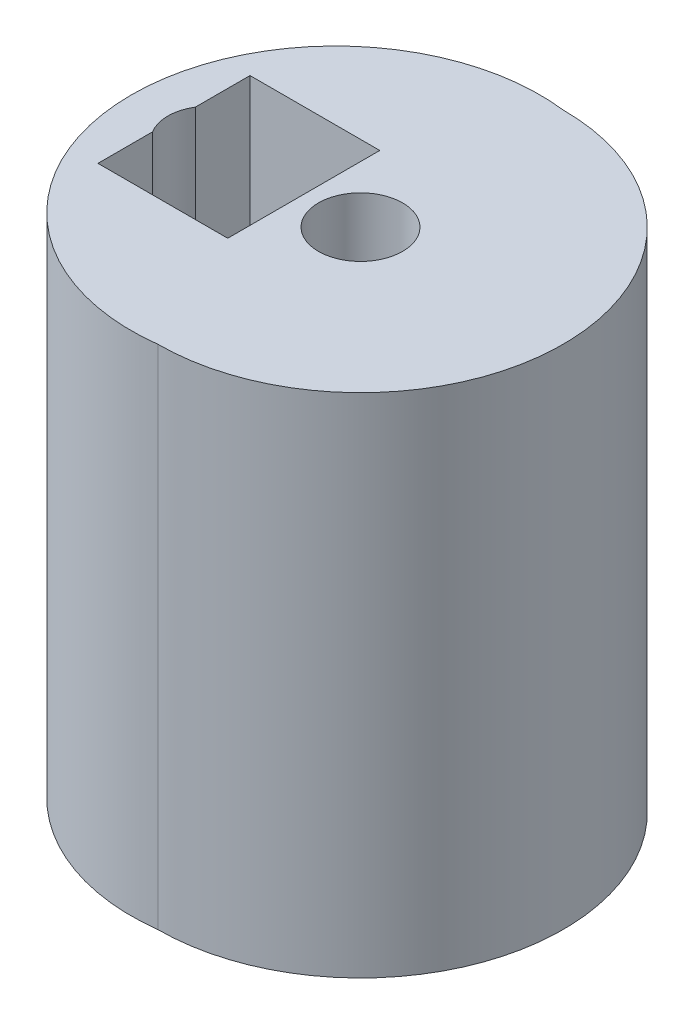
ISO-10303-21;
HEADER;
FILE_DESCRIPTION(('STEP AP214'),'2;1');
FILE_NAME('part.step','',(''),(''),'','','');
FILE_SCHEMA(('AUTOMOTIVE_DESIGN { 1 0 10303 214 1 1 1 1 }'));
ENDSEC;
DATA;
#1=APPLICATION_CONTEXT('core data for automotive mechanical design processes');
#2=APPLICATION_PROTOCOL_DEFINITION('international standard','automotive_design',2000,#1);
#3=PRODUCT_CONTEXT('',#1,'mechanical');
#4=PRODUCT('Part','Part','',(#3));
#5=PRODUCT_RELATED_PRODUCT_CATEGORY('part','',(#4));
#6=PRODUCT_DEFINITION_FORMATION('','',#4);
#7=PRODUCT_DEFINITION_CONTEXT('part definition',#1,'design');
#8=PRODUCT_DEFINITION('design','',#6,#7);
#9=PRODUCT_DEFINITION_SHAPE('','',#8);
#10=(LENGTH_UNIT() NAMED_UNIT(*) SI_UNIT(.MILLI.,.METRE.));
#11=(NAMED_UNIT(*) PLANE_ANGLE_UNIT() SI_UNIT($,.RADIAN.));
#12=(NAMED_UNIT(*) SI_UNIT($,.STERADIAN.) SOLID_ANGLE_UNIT());
#13=UNCERTAINTY_MEASURE_WITH_UNIT(LENGTH_MEASURE(1.E-05),#10,'distance_accuracy_value','');
#14=(GEOMETRIC_REPRESENTATION_CONTEXT(3) GLOBAL_UNCERTAINTY_ASSIGNED_CONTEXT((#13)) GLOBAL_UNIT_ASSIGNED_CONTEXT((#10,
#11,#12)) REPRESENTATION_CONTEXT('',''));
#15=CARTESIAN_POINT('',(0.,0.,0.));
#16=DIRECTION('',(0.,0.,1.));
#17=DIRECTION('',(1.,0.,0.));
#18=AXIS2_PLACEMENT_3D('',#15,#16,#17);
#19=CARTESIAN_POINT('',(-2.45407823836158,50.,0.));
#20=DIRECTION('',(0.,-1.,0.));
#21=DIRECTION('',(0.,0.,-1.));
#22=AXIS2_PLACEMENT_3D('',#19,#20,#21);
#23=CYLINDRICAL_SURFACE('',#22,20.15);
#24=CARTESIAN_POINT('',(-2.45407823836158,0.,0.));
#25=DIRECTION('',(0.,1.,0.));
#26=DIRECTION('',(0.,0.,1.));
#27=AXIS2_PLACEMENT_3D('',#24,#25,#26);
#28=CIRCLE('',#27,20.15);
#29=CARTESIAN_POINT('',(0.,0.,-20.));
#30=VERTEX_POINT('',#29);
#31=CARTESIAN_POINT('',(0.,0.,20.));
#32=VERTEX_POINT('',#31);
#33=EDGE_CURVE('E180',#30,#32,#28,.T.);
#34=ORIENTED_EDGE('',*,*,#33,.T.);
#35=DIRECTION('',(0.,-1.,0.));
#36=VECTOR('',#35,1.);
#37=CARTESIAN_POINT('',(0.,50.,20.));
#38=LINE('',#37,#36);
#39=CARTESIAN_POINT('',(0.,50.,20.));
#40=VERTEX_POINT('',#39);
#41=EDGE_CURVE('E193',#40,#32,#38,.T.);
#42=ORIENTED_EDGE('',*,*,#41,.F.);
#43=CARTESIAN_POINT('',(-2.45407823836158,50.,0.));
#44=DIRECTION('',(0.,1.,0.));
#45=DIRECTION('',(0.,0.,1.));
#46=AXIS2_PLACEMENT_3D('',#43,#44,#45);
#47=CIRCLE('',#46,20.15);
#48=CARTESIAN_POINT('',(0.,50.,-20.));
#49=VERTEX_POINT('',#48);
#50=EDGE_CURVE('E181',#49,#40,#47,.T.);
#51=ORIENTED_EDGE('',*,*,#50,.F.);
#52=DIRECTION('',(0.,-1.,0.));
#53=VECTOR('',#52,1.);
#54=CARTESIAN_POINT('',(0.,50.,-20.));
#55=LINE('',#54,#53);
#56=EDGE_CURVE('E187',#49,#30,#55,.T.);
#57=ORIENTED_EDGE('',*,*,#56,.T.);
#58=EDGE_LOOP('',(#34,#42,#51,#57));
#59=FACE_BOUND('',#58,.T.);
#60=ADVANCED_FACE('F36',(#59),#23,.T.);
#61=CARTESIAN_POINT('',(0.,50.,0.));
#62=DIRECTION('',(0.,-1.,0.));
#63=DIRECTION('',(0.,0.,-1.));
#64=AXIS2_PLACEMENT_3D('',#61,#62,#63);
#65=CYLINDRICAL_SURFACE('',#64,20.);
#66=CARTESIAN_POINT('',(0.,0.,0.));
#67=DIRECTION('',(0.,1.,0.));
#68=DIRECTION('',(0.,0.,-1.));
#69=AXIS2_PLACEMENT_3D('',#66,#67,#68);
#70=CIRCLE('',#69,20.);
#71=EDGE_CURVE('E185',#32,#30,#70,.T.);
#72=ORIENTED_EDGE('',*,*,#71,.T.);
#73=ORIENTED_EDGE('',*,*,#56,.F.);
#74=CARTESIAN_POINT('',(0.,50.,0.));
#75=DIRECTION('',(0.,1.,0.));
#76=DIRECTION('',(0.,0.,-1.));
#77=AXIS2_PLACEMENT_3D('',#74,#75,#76);
#78=CIRCLE('',#77,20.);
#79=EDGE_CURVE('E184',#40,#49,#78,.T.);
#80=ORIENTED_EDGE('',*,*,#79,.F.);
#81=ORIENTED_EDGE('',*,*,#41,.T.);
#82=EDGE_LOOP('',(#72,#73,#80,#81));
#83=FACE_BOUND('',#82,.T.);
#84=ADVANCED_FACE('F230',(#83),#65,.T.);
#85=CARTESIAN_POINT('',(-1.22703911918079,50.,0.));
#86=DIRECTION('',(0.,1.,0.));
#87=DIRECTION('',(0.,0.,1.));
#88=AXIS2_PLACEMENT_3D('',#85,#86,#87);
#89=PLANE('',#88);
#90=CARTESIAN_POINT('',(-15.,50.,0.));
#91=DIRECTION('',(0.,1.,0.));
#92=DIRECTION('',(0.,0.,1.));
#93=AXIS2_PLACEMENT_3D('',#90,#91,#92);
#94=CIRCLE('',#93,4.00000000000001);
#95=CARTESIAN_POINT('',(-18.4,50.,-2.10713075057054));
#96=VERTEX_POINT('',#95);
#97=CARTESIAN_POINT('',(-18.4,50.,2.10713075057054));
#98=VERTEX_POINT('',#97);
#99=EDGE_CURVE('E50',#96,#98,#94,.T.);
#100=ORIENTED_EDGE('',*,*,#99,.F.);
#101=DIRECTION('',(0.,0.,1.));
#102=VECTOR('',#101,1.);
#103=CARTESIAN_POINT('',(-18.4,50.,-7.5));
#104=LINE('',#103,#102);
#105=CARTESIAN_POINT('',(-18.4,50.,-7.5));
#106=VERTEX_POINT('',#105);
#107=EDGE_CURVE('E136',#106,#96,#104,.T.);
#108=ORIENTED_EDGE('',*,*,#107,.F.);
#109=DIRECTION('',(-1.,0.,0.));
#110=VECTOR('',#109,1.);
#111=CARTESIAN_POINT('',(-5.6,50.,-7.5));
#112=LINE('',#111,#110);
#113=CARTESIAN_POINT('',(-5.6,50.,-7.5));
#114=VERTEX_POINT('',#113);
#115=EDGE_CURVE('E139',#114,#106,#112,.T.);
#116=ORIENTED_EDGE('',*,*,#115,.F.);
#117=DIRECTION('',(0.,0.,-1.));
#118=VECTOR('',#117,1.);
#119=CARTESIAN_POINT('',(-5.6,50.,7.5));
#120=LINE('',#119,#118);
#121=CARTESIAN_POINT('',(-5.6,50.,7.5));
#122=VERTEX_POINT('',#121);
#123=EDGE_CURVE('E152',#122,#114,#120,.T.);
#124=ORIENTED_EDGE('',*,*,#123,.F.);
#125=DIRECTION('',(1.,0.,0.));
#126=VECTOR('',#125,1.);
#127=CARTESIAN_POINT('',(-5.6,50.,7.5));
#128=LINE('',#127,#126);
#129=CARTESIAN_POINT('',(-18.4,50.,7.5));
#130=VERTEX_POINT('',#129);
#131=EDGE_CURVE('E149',#130,#122,#128,.T.);
#132=ORIENTED_EDGE('',*,*,#131,.F.);
#133=DIRECTION('',(0.,0.,1.));
#134=VECTOR('',#133,1.);
#135=CARTESIAN_POINT('',(-18.4,50.,2.10713075057054));
#136=LINE('',#135,#134);
#137=EDGE_CURVE('E147',#98,#130,#136,.T.);
#138=ORIENTED_EDGE('',*,*,#137,.F.);
#139=EDGE_LOOP('',(#100,#108,#116,#124,#132,#138));
#140=FACE_BOUND('',#139,.T.);
#141=CARTESIAN_POINT('',(0.,50.,0.));
#142=DIRECTION('',(0.,1.,0.));
#143=DIRECTION('',(0.,0.,1.));
#144=AXIS2_PLACEMENT_3D('',#141,#142,#143);
#145=CIRCLE('',#144,4.15);
#146=CARTESIAN_POINT('',(0.,50.,4.15));
#147=VERTEX_POINT('',#146);
#148=EDGE_CURVE('E170',#147,#147,#145,.T.);
#149=ORIENTED_EDGE('',*,*,#148,.F.);
#150=EDGE_LOOP('',(#149));
#151=FACE_BOUND('',#150,.T.);
#152=ORIENTED_EDGE('',*,*,#50,.T.);
#153=ORIENTED_EDGE('',*,*,#79,.T.);
#154=EDGE_LOOP('',(#152,#153));
#155=FACE_BOUND('',#154,.T.);
#156=ADVANCED_FACE('F216',(#140,#151,#155),#89,.T.);
#157=CARTESIAN_POINT('',(-1.22703911918079,0.,0.));
#158=DIRECTION('',(0.,1.,0.));
#159=DIRECTION('',(0.,0.,1.));
#160=AXIS2_PLACEMENT_3D('',#157,#158,#159);
#161=PLANE('',#160);
#162=CARTESIAN_POINT('',(0.,0.,0.));
#163=DIRECTION('',(0.,-1.,0.));
#164=DIRECTION('',(0.,0.,-1.));
#165=AXIS2_PLACEMENT_3D('',#162,#163,#164);
#166=CIRCLE('',#165,13.5);
#167=CARTESIAN_POINT('',(-11.2249721603218,0.,-7.5));
#168=VERTEX_POINT('',#167);
#169=CARTESIAN_POINT('',(-11.2249721603218,0.,7.5));
#170=VERTEX_POINT('',#169);
#171=EDGE_CURVE('E174',#168,#170,#166,.T.);
#172=ORIENTED_EDGE('',*,*,#171,.F.);
#173=DIRECTION('',(-1.,0.,0.));
#174=VECTOR('',#173,1.);
#175=CARTESIAN_POINT('',(-5.6,0.,-7.5));
#176=LINE('',#175,#174);
#177=CARTESIAN_POINT('',(-18.4,0.,-7.5));
#178=VERTEX_POINT('',#177);
#179=EDGE_CURVE('E143',#168,#178,#176,.T.);
#180=ORIENTED_EDGE('',*,*,#179,.T.);
#181=DIRECTION('',(0.,0.,1.));
#182=VECTOR('',#181,1.);
#183=CARTESIAN_POINT('',(-18.4,0.,-7.5));
#184=LINE('',#183,#182);
#185=CARTESIAN_POINT('',(-18.4,0.,-2.10713075057054));
#186=VERTEX_POINT('',#185);
#187=EDGE_CURVE('E121',#178,#186,#184,.T.);
#188=ORIENTED_EDGE('',*,*,#187,.T.);
#189=CARTESIAN_POINT('',(-15.,0.,0.));
#190=DIRECTION('',(0.,1.,0.));
#191=DIRECTION('',(0.,0.,1.));
#192=AXIS2_PLACEMENT_3D('',#189,#190,#191);
#193=CIRCLE('',#192,4.00000000000001);
#194=CARTESIAN_POINT('',(-18.4,0.,2.10713075057054));
#195=VERTEX_POINT('',#194);
#196=EDGE_CURVE('E115',#186,#195,#193,.T.);
#197=ORIENTED_EDGE('',*,*,#196,.T.);
#198=DIRECTION('',(0.,0.,1.));
#199=VECTOR('',#198,1.);
#200=CARTESIAN_POINT('',(-18.4,0.,2.10713075057054));
#201=LINE('',#200,#199);
#202=CARTESIAN_POINT('',(-18.4,0.,7.5));
#203=VERTEX_POINT('',#202);
#204=EDGE_CURVE('E124',#195,#203,#201,.T.);
#205=ORIENTED_EDGE('',*,*,#204,.T.);
#206=DIRECTION('',(1.,0.,0.));
#207=VECTOR('',#206,1.);
#208=CARTESIAN_POINT('',(-5.6,0.,7.5));
#209=LINE('',#208,#207);
#210=EDGE_CURVE('E129',#203,#170,#209,.T.);
#211=ORIENTED_EDGE('',*,*,#210,.T.);
#212=EDGE_LOOP('',(#172,#180,#188,#197,#205,#211));
#213=FACE_BOUND('',#212,.T.);
#214=ORIENTED_EDGE('',*,*,#33,.F.);
#215=ORIENTED_EDGE('',*,*,#71,.F.);
#216=EDGE_LOOP('',(#214,#215));
#217=FACE_BOUND('',#216,.T.);
#218=ADVANCED_FACE('F132',(#213,#217),#161,.F.);
#219=CARTESIAN_POINT('',(-1.22703911918079,32.,0.));
#220=DIRECTION('',(0.,1.,0.));
#221=DIRECTION('',(0.,0.,1.));
#222=AXIS2_PLACEMENT_3D('',#219,#220,#221);
#223=PLANE('',#222);
#224=CARTESIAN_POINT('',(0.,32.,0.));
#225=DIRECTION('',(0.,1.,0.));
#226=DIRECTION('',(0.,0.,1.));
#227=AXIS2_PLACEMENT_3D('',#224,#225,#226);
#228=CIRCLE('',#227,4.15);
#229=CARTESIAN_POINT('',(0.,32.,4.15));
#230=VERTEX_POINT('',#229);
#231=EDGE_CURVE('E173',#230,#230,#228,.T.);
#232=ORIENTED_EDGE('',*,*,#231,.T.);
#233=EDGE_LOOP('',(#232));
#234=FACE_BOUND('',#233,.T.);
#235=DIRECTION('',(0.,0.,-1.));
#236=VECTOR('',#235,1.);
#237=CARTESIAN_POINT('',(-5.6,32.,0.));
#238=LINE('',#237,#236);
#239=CARTESIAN_POINT('',(-5.6,32.,7.5));
#240=VERTEX_POINT('',#239);
#241=CARTESIAN_POINT('',(-5.6,32.,-7.5));
#242=VERTEX_POINT('',#241);
#243=EDGE_CURVE('E12',#240,#242,#238,.T.);
#244=ORIENTED_EDGE('',*,*,#243,.T.);
#245=DIRECTION('',(-1.,0.,0.));
#246=VECTOR('',#245,1.);
#247=CARTESIAN_POINT('',(-1.22703911918079,32.,-7.5));
#248=LINE('',#247,#246);
#249=CARTESIAN_POINT('',(-11.2249721603218,32.,-7.5));
#250=VERTEX_POINT('',#249);
#251=EDGE_CURVE('E167',#242,#250,#248,.T.);
#252=ORIENTED_EDGE('',*,*,#251,.T.);
#253=CARTESIAN_POINT('',(0.,32.,0.));
#254=DIRECTION('',(0.,1.,0.));
#255=DIRECTION('',(0.,0.,1.));
#256=AXIS2_PLACEMENT_3D('',#253,#254,#255);
#257=CIRCLE('',#256,13.5);
#258=CARTESIAN_POINT('',(-11.2249721603218,32.,7.5));
#259=VERTEX_POINT('',#258);
#260=EDGE_CURVE('E177',#250,#259,#257,.F.);
#261=ORIENTED_EDGE('',*,*,#260,.T.);
#262=DIRECTION('',(1.,0.,0.));
#263=VECTOR('',#262,1.);
#264=CARTESIAN_POINT('',(-1.22703911918079,32.,7.5));
#265=LINE('',#264,#263);
#266=EDGE_CURVE('E58',#259,#240,#265,.T.);
#267=ORIENTED_EDGE('',*,*,#266,.T.);
#268=EDGE_LOOP('',(#244,#252,#261,#267));
#269=FACE_BOUND('',#268,.T.);
#270=ADVANCED_FACE('F206',(#234,#269),#223,.F.);
#271=CARTESIAN_POINT('',(0.,88.1837661840736,0.));
#272=DIRECTION('',(0.,-1.,0.));
#273=DIRECTION('',(0.,0.,-1.));
#274=AXIS2_PLACEMENT_3D('',#271,#272,#273);
#275=CYLINDRICAL_SURFACE('',#274,13.5);
#276=ORIENTED_EDGE('',*,*,#260,.F.);
#277=DIRECTION('',(0.,-1.,0.));
#278=VECTOR('',#277,1.);
#279=CARTESIAN_POINT('',(-11.2249721603218,88.1837661840736,-7.5));
#280=LINE('',#279,#278);
#281=EDGE_CURVE('E43',#250,#168,#280,.T.);
#282=ORIENTED_EDGE('',*,*,#281,.T.);
#283=ORIENTED_EDGE('',*,*,#171,.T.);
#284=DIRECTION('',(0.,-1.,0.));
#285=VECTOR('',#284,1.);
#286=CARTESIAN_POINT('',(-11.2249721603218,88.1837661840736,7.5));
#287=LINE('',#286,#285);
#288=EDGE_CURVE('E196',#170,#259,#287,.F.);
#289=ORIENTED_EDGE('',*,*,#288,.T.);
#290=EDGE_LOOP('',(#276,#282,#283,#289));
#291=FACE_BOUND('',#290,.T.);
#292=ADVANCED_FACE('F202',(#291),#275,.F.);
#293=CARTESIAN_POINT('',(0.,0.,0.));
#294=DIRECTION('',(0.,1.,0.));
#295=DIRECTION('',(0.,0.,1.));
#296=AXIS2_PLACEMENT_3D('',#293,#294,#295);
#297=CYLINDRICAL_SURFACE('',#296,4.15);
#298=ORIENTED_EDGE('',*,*,#148,.T.);
#299=EDGE_LOOP('',(#298));
#300=FACE_BOUND('',#299,.T.);
#301=ORIENTED_EDGE('',*,*,#231,.F.);
#302=EDGE_LOOP('',(#301));
#303=FACE_BOUND('',#302,.T.);
#304=ADVANCED_FACE('F253',(#300,#303),#297,.F.);
#305=CARTESIAN_POINT('',(-5.6,0.,7.5));
#306=DIRECTION('',(1.,0.,0.));
#307=DIRECTION('',(0.,0.,-1.));
#308=AXIS2_PLACEMENT_3D('',#305,#306,#307);
#309=PLANE('',#308);
#310=DIRECTION('',(0.,1.,0.));
#311=VECTOR('',#310,1.);
#312=CARTESIAN_POINT('',(-5.6,0.,7.5));
#313=LINE('',#312,#311);
#314=EDGE_CURVE('E163',#240,#122,#313,.T.);
#315=ORIENTED_EDGE('',*,*,#314,.T.);
#316=ORIENTED_EDGE('',*,*,#123,.T.);
#317=DIRECTION('',(0.,1.,0.));
#318=VECTOR('',#317,1.);
#319=CARTESIAN_POINT('',(-5.6,0.,-7.5));
#320=LINE('',#319,#318);
#321=EDGE_CURVE('E161',#242,#114,#320,.T.);
#322=ORIENTED_EDGE('',*,*,#321,.F.);
#323=ORIENTED_EDGE('',*,*,#243,.F.);
#324=EDGE_LOOP('',(#315,#316,#322,#323));
#325=FACE_BOUND('',#324,.T.);
#326=ADVANCED_FACE('F210',(#325),#309,.F.);
#327=CARTESIAN_POINT('',(-5.6,0.,-7.5));
#328=DIRECTION('',(0.,0.,-1.));
#329=DIRECTION('',(-1.,0.,0.));
#330=AXIS2_PLACEMENT_3D('',#327,#328,#329);
#331=PLANE('',#330);
#332=ORIENTED_EDGE('',*,*,#321,.T.);
#333=ORIENTED_EDGE('',*,*,#115,.T.);
#334=DIRECTION('',(0.,1.,0.));
#335=VECTOR('',#334,1.);
#336=CARTESIAN_POINT('',(-18.4,0.,-7.5));
#337=LINE('',#336,#335);
#338=EDGE_CURVE('E159',#178,#106,#337,.T.);
#339=ORIENTED_EDGE('',*,*,#338,.F.);
#340=ORIENTED_EDGE('',*,*,#179,.F.);
#341=ORIENTED_EDGE('',*,*,#281,.F.);
#342=ORIENTED_EDGE('',*,*,#251,.F.);
#343=EDGE_LOOP('',(#332,#333,#339,#340,#341,#342));
#344=FACE_BOUND('',#343,.T.);
#345=ADVANCED_FACE('F208',(#344),#331,.F.);
#346=CARTESIAN_POINT('',(-5.6,0.,7.5));
#347=DIRECTION('',(0.,0.,1.));
#348=DIRECTION('',(1.,0.,0.));
#349=AXIS2_PLACEMENT_3D('',#346,#347,#348);
#350=PLANE('',#349);
#351=ORIENTED_EDGE('',*,*,#288,.F.);
#352=ORIENTED_EDGE('',*,*,#210,.F.);
#353=DIRECTION('',(0.,1.,0.));
#354=VECTOR('',#353,1.);
#355=CARTESIAN_POINT('',(-18.4,0.,7.5));
#356=LINE('',#355,#354);
#357=EDGE_CURVE('E120',#203,#130,#356,.T.);
#358=ORIENTED_EDGE('',*,*,#357,.T.);
#359=ORIENTED_EDGE('',*,*,#131,.T.);
#360=ORIENTED_EDGE('',*,*,#314,.F.);
#361=ORIENTED_EDGE('',*,*,#266,.F.);
#362=EDGE_LOOP('',(#351,#352,#358,#359,#360,#361));
#363=FACE_BOUND('',#362,.T.);
#364=ADVANCED_FACE('F204',(#363),#350,.F.);
#365=CARTESIAN_POINT('',(-15.,0.,0.));
#366=DIRECTION('',(0.,1.,0.));
#367=DIRECTION('',(0.,0.,1.));
#368=AXIS2_PLACEMENT_3D('',#365,#366,#367);
#369=CYLINDRICAL_SURFACE('',#368,4.00000000000001);
#370=ORIENTED_EDGE('',*,*,#99,.T.);
#371=DIRECTION('',(0.,1.,0.));
#372=VECTOR('',#371,1.);
#373=CARTESIAN_POINT('',(-18.4,0.,2.10713075057054));
#374=LINE('',#373,#372);
#375=EDGE_CURVE('E111',#195,#98,#374,.T.);
#376=ORIENTED_EDGE('',*,*,#375,.F.);
#377=ORIENTED_EDGE('',*,*,#196,.F.);
#378=DIRECTION('',(0.,1.,0.));
#379=VECTOR('',#378,1.);
#380=CARTESIAN_POINT('',(-18.4,0.,-2.10713075057054));
#381=LINE('',#380,#379);
#382=EDGE_CURVE('E157',#186,#96,#381,.T.);
#383=ORIENTED_EDGE('',*,*,#382,.T.);
#384=EDGE_LOOP('',(#370,#376,#377,#383));
#385=FACE_BOUND('',#384,.T.);
#386=ADVANCED_FACE('F113',(#385),#369,.F.);
#387=CARTESIAN_POINT('',(-18.4,0.,-7.5));
#388=DIRECTION('',(-1.,0.,0.));
#389=DIRECTION('',(0.,0.,1.));
#390=AXIS2_PLACEMENT_3D('',#387,#388,#389);
#391=PLANE('',#390);
#392=ORIENTED_EDGE('',*,*,#107,.T.);
#393=ORIENTED_EDGE('',*,*,#382,.F.);
#394=ORIENTED_EDGE('',*,*,#187,.F.);
#395=ORIENTED_EDGE('',*,*,#338,.T.);
#396=EDGE_LOOP('',(#392,#393,#394,#395));
#397=FACE_BOUND('',#396,.T.);
#398=ADVANCED_FACE('F219',(#397),#391,.F.);
#399=CARTESIAN_POINT('',(-18.4,0.,2.10713075057054));
#400=DIRECTION('',(-1.,0.,0.));
#401=DIRECTION('',(0.,0.,1.));
#402=AXIS2_PLACEMENT_3D('',#399,#400,#401);
#403=PLANE('',#402);
#404=ORIENTED_EDGE('',*,*,#137,.T.);
#405=ORIENTED_EDGE('',*,*,#357,.F.);
#406=ORIENTED_EDGE('',*,*,#204,.F.);
#407=ORIENTED_EDGE('',*,*,#375,.T.);
#408=EDGE_LOOP('',(#404,#405,#406,#407));
#409=FACE_BOUND('',#408,.T.);
#410=ADVANCED_FACE('F125',(#409),#403,.F.);
#411=CLOSED_SHELL('',(#60,#84,#156,#218,#270,#292,#304,#326,#345,#364,#386,#398,#410));
#412=MANIFOLD_SOLID_BREP('B2',#411);
#413=ADVANCED_BREP_SHAPE_REPRESENTATION('',(#18,#412),#14);
#414=SHAPE_DEFINITION_REPRESENTATION(#9,#413);
ENDSEC;
END-ISO-10303-21;
